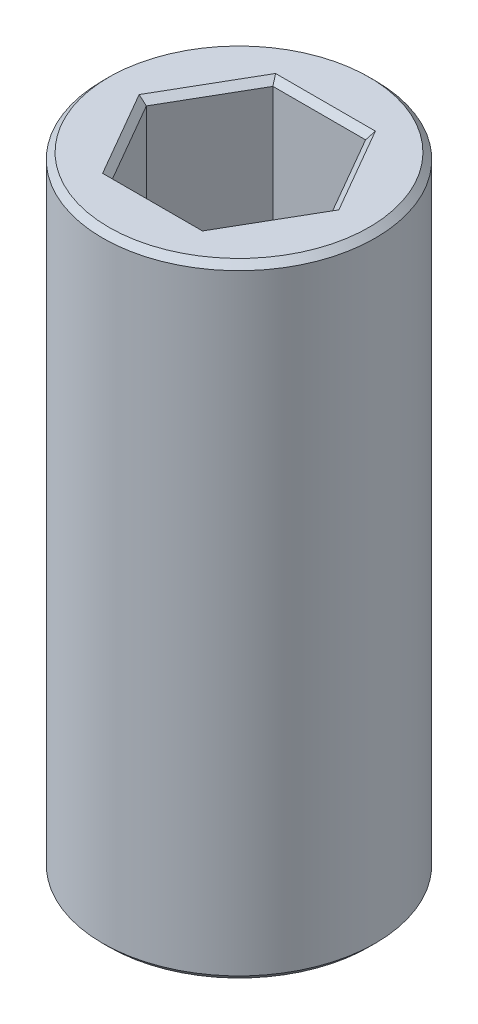
ISO-10303-21;
HEADER;
FILE_DESCRIPTION(('STEP AP214'),'2;1');
FILE_NAME('part.step','',(''),(''),'','','');
FILE_SCHEMA(('AUTOMOTIVE_DESIGN { 1 0 10303 214 1 1 1 1 }'));
ENDSEC;
DATA;
#1=APPLICATION_CONTEXT('core data for automotive mechanical design processes');
#2=APPLICATION_PROTOCOL_DEFINITION('international standard','automotive_design',2000,#1);
#3=PRODUCT_CONTEXT('',#1,'mechanical');
#4=PRODUCT('Part','Part','',(#3));
#5=PRODUCT_RELATED_PRODUCT_CATEGORY('part','',(#4));
#6=PRODUCT_DEFINITION_FORMATION('','',#4);
#7=PRODUCT_DEFINITION_CONTEXT('part definition',#1,'design');
#8=PRODUCT_DEFINITION('design','',#6,#7);
#9=PRODUCT_DEFINITION_SHAPE('','',#8);
#10=(LENGTH_UNIT() NAMED_UNIT(*) SI_UNIT(.MILLI.,.METRE.));
#11=(NAMED_UNIT(*) PLANE_ANGLE_UNIT() SI_UNIT($,.RADIAN.));
#12=(NAMED_UNIT(*) SI_UNIT($,.STERADIAN.) SOLID_ANGLE_UNIT());
#13=UNCERTAINTY_MEASURE_WITH_UNIT(LENGTH_MEASURE(1.E-05),#10,'distance_accuracy_value','');
#14=(GEOMETRIC_REPRESENTATION_CONTEXT(3) GLOBAL_UNCERTAINTY_ASSIGNED_CONTEXT((#13)) GLOBAL_UNIT_ASSIGNED_CONTEXT((#10,
#11,#12)) REPRESENTATION_CONTEXT('',''));
#15=CARTESIAN_POINT('',(0.,0.,0.));
#16=DIRECTION('',(0.,0.,1.));
#17=DIRECTION('',(1.,0.,0.));
#18=AXIS2_PLACEMENT_3D('',#15,#16,#17);
#19=CARTESIAN_POINT('',(0.,50.8,0.));
#20=DIRECTION('',(0.,1.,0.));
#21=DIRECTION('',(0.,0.,1.));
#22=AXIS2_PLACEMENT_3D('',#19,#20,#21);
#23=PLANE('',#22);
#24=CARTESIAN_POINT('',(0.,50.8,0.));
#25=DIRECTION('',(0.,1.,0.));
#26=DIRECTION('',(0.,0.,1.));
#27=AXIS2_PLACEMENT_3D('',#24,#25,#26);
#28=CIRCLE('',#27,10.6045);
#29=CARTESIAN_POINT('',(0.,50.8,10.6045));
#30=VERTEX_POINT('',#29);
#31=EDGE_CURVE('E11',#30,#30,#28,.T.);
#32=ORIENTED_EDGE('',*,*,#31,.T.);
#33=EDGE_LOOP('',(#32));
#34=FACE_BOUND('',#33,.T.);
#35=DIRECTION('',(-0.500000000000001,0.,-0.866025403784438));
#36=VECTOR('',#35,1.);
#37=CARTESIAN_POINT('',(-6.10418005857461,50.8,3.52425));
#38=LINE('',#37,#36);
#39=CARTESIAN_POINT('',(-4.06945337238307,50.8,7.0485));
#40=VERTEX_POINT('',#39);
#41=CARTESIAN_POINT('',(-8.13890674476615,50.8,0.));
#42=VERTEX_POINT('',#41);
#43=EDGE_CURVE('E62',#40,#42,#38,.T.);
#44=ORIENTED_EDGE('',*,*,#43,.T.);
#45=DIRECTION('',(0.5,0.,-0.866025403784439));
#46=VECTOR('',#45,1.);
#47=CARTESIAN_POINT('',(-6.10418005857462,50.8,-3.52425));
#48=LINE('',#47,#46);
#49=CARTESIAN_POINT('',(-4.06945337238308,50.8,-7.0485));
#50=VERTEX_POINT('',#49);
#51=EDGE_CURVE('E54',#42,#50,#48,.T.);
#52=ORIENTED_EDGE('',*,*,#51,.T.);
#53=DIRECTION('',(1.,0.,0.));
#54=VECTOR('',#53,1.);
#55=CARTESIAN_POINT('',(0.,50.8,-7.0485));
#56=LINE('',#55,#54);
#57=CARTESIAN_POINT('',(4.06945337238308,50.8,-7.0485));
#58=VERTEX_POINT('',#57);
#59=EDGE_CURVE('E230',#50,#58,#56,.T.);
#60=ORIENTED_EDGE('',*,*,#59,.T.);
#61=DIRECTION('',(0.5,0.,0.866025403784439));
#62=VECTOR('',#61,1.);
#63=CARTESIAN_POINT('',(6.10418005857462,50.8,-3.52425));
#64=LINE('',#63,#62);
#65=CARTESIAN_POINT('',(8.13890674476615,50.8,0.));
#66=VERTEX_POINT('',#65);
#67=EDGE_CURVE('E233',#58,#66,#64,.T.);
#68=ORIENTED_EDGE('',*,*,#67,.T.);
#69=DIRECTION('',(-0.499999999999999,0.,0.866025403784439));
#70=VECTOR('',#69,1.);
#71=CARTESIAN_POINT('',(6.10418005857462,50.8,3.52425));
#72=LINE('',#71,#70);
#73=CARTESIAN_POINT('',(4.06945337238308,50.8,7.0485));
#74=VERTEX_POINT('',#73);
#75=EDGE_CURVE('E236',#66,#74,#72,.T.);
#76=ORIENTED_EDGE('',*,*,#75,.T.);
#77=DIRECTION('',(-1.,0.,0.));
#78=VECTOR('',#77,1.);
#79=CARTESIAN_POINT('',(0.,50.8,7.0485));
#80=LINE('',#79,#78);
#81=EDGE_CURVE('E67',#74,#40,#80,.T.);
#82=ORIENTED_EDGE('',*,*,#81,.T.);
#83=EDGE_LOOP('',(#44,#52,#60,#68,#76,#82));
#84=FACE_BOUND('',#83,.T.);
#85=ADVANCED_FACE('F43',(#34,#84),#23,.T.);
#86=CARTESIAN_POINT('',(0.,0.,0.));
#87=DIRECTION('',(0.,1.,0.));
#88=DIRECTION('',(0.,0.,1.));
#89=AXIS2_PLACEMENT_3D('',#86,#87,#88);
#90=PLANE('',#89);
#91=DIRECTION('',(0.499999999999999,0.,-0.866025403784439));
#92=VECTOR('',#91,1.);
#93=CARTESIAN_POINT('',(7.99225977639198,0.,0.253999999999993));
#94=LINE('',#93,#92);
#95=CARTESIAN_POINT('',(4.06945337238308,0.,7.0485));
#96=VERTEX_POINT('',#95);
#97=CARTESIAN_POINT('',(8.13890674476615,0.,0.));
#98=VERTEX_POINT('',#97);
#99=EDGE_CURVE('E141',#96,#98,#94,.T.);
#100=ORIENTED_EDGE('',*,*,#99,.T.);
#101=DIRECTION('',(-0.5,0.,-0.866025403784439));
#102=VECTOR('',#101,1.);
#103=CARTESIAN_POINT('',(4.21610034075724,0.,-6.7945));
#104=LINE('',#103,#102);
#105=CARTESIAN_POINT('',(4.06945337238307,0.,-7.0485));
#106=VERTEX_POINT('',#105);
#107=EDGE_CURVE('E182',#98,#106,#104,.T.);
#108=ORIENTED_EDGE('',*,*,#107,.T.);
#109=DIRECTION('',(-1.,0.,0.));
#110=VECTOR('',#109,1.);
#111=CARTESIAN_POINT('',(-3.77615943563475,0.,-7.0485));
#112=LINE('',#111,#110);
#113=CARTESIAN_POINT('',(-4.06945337238307,0.,-7.0485));
#114=VERTEX_POINT('',#113);
#115=EDGE_CURVE('E179',#106,#114,#112,.T.);
#116=ORIENTED_EDGE('',*,*,#115,.T.);
#117=DIRECTION('',(-0.5,0.,0.866025403784439));
#118=VECTOR('',#117,1.);
#119=CARTESIAN_POINT('',(-7.99225977639198,0.,-0.253999999999991));
#120=LINE('',#119,#118);
#121=CARTESIAN_POINT('',(-8.13890674476615,0.,0.));
#122=VERTEX_POINT('',#121);
#123=EDGE_CURVE('E176',#114,#122,#120,.T.);
#124=ORIENTED_EDGE('',*,*,#123,.T.);
#125=DIRECTION('',(0.500000000000001,0.,0.866025403784438));
#126=VECTOR('',#125,1.);
#127=CARTESIAN_POINT('',(-4.21610034075723,0.,6.7945));
#128=LINE('',#127,#126);
#129=CARTESIAN_POINT('',(-4.06945337238307,0.,7.0485));
#130=VERTEX_POINT('',#129);
#131=EDGE_CURVE('E144',#122,#130,#128,.T.);
#132=ORIENTED_EDGE('',*,*,#131,.T.);
#133=DIRECTION('',(1.,0.,0.));
#134=VECTOR('',#133,1.);
#135=CARTESIAN_POINT('',(3.77615943563475,0.,7.0485));
#136=LINE('',#135,#134);
#137=EDGE_CURVE('E135',#130,#96,#136,.T.);
#138=ORIENTED_EDGE('',*,*,#137,.T.);
#139=EDGE_LOOP('',(#100,#108,#116,#124,#132,#138));
#140=FACE_BOUND('',#139,.T.);
#141=CARTESIAN_POINT('',(0.,0.,0.));
#142=DIRECTION('',(0.,1.,0.));
#143=DIRECTION('',(0.,0.,1.));
#144=AXIS2_PLACEMENT_3D('',#141,#142,#143);
#145=CIRCLE('',#144,10.6045);
#146=CARTESIAN_POINT('',(0.,0.,10.6045));
#147=VERTEX_POINT('',#146);
#148=EDGE_CURVE('E165',#147,#147,#145,.F.);
#149=ORIENTED_EDGE('',*,*,#148,.T.);
#150=EDGE_LOOP('',(#149));
#151=FACE_BOUND('',#150,.T.);
#152=ADVANCED_FACE('F137',(#140,#151),#90,.F.);
#153=CARTESIAN_POINT('',(0.,50.8,0.));
#154=DIRECTION('',(0.,-1.,0.));
#155=DIRECTION('',(0.,0.,-1.));
#156=AXIS2_PLACEMENT_3D('',#153,#154,#155);
#157=CYLINDRICAL_SURFACE('',#156,11.1125);
#158=CARTESIAN_POINT('',(0.,0.507999999999988,0.));
#159=DIRECTION('',(0.,1.,0.));
#160=DIRECTION('',(0.,0.,1.));
#161=AXIS2_PLACEMENT_3D('',#158,#159,#160);
#162=CIRCLE('',#161,11.1125);
#163=CARTESIAN_POINT('',(0.,0.507999999999988,11.1125));
#164=VERTEX_POINT('',#163);
#165=EDGE_CURVE('E226',#164,#164,#162,.T.);
#166=ORIENTED_EDGE('',*,*,#165,.T.);
#167=EDGE_LOOP('',(#166));
#168=FACE_BOUND('',#167,.T.);
#169=CARTESIAN_POINT('',(0.,50.292,0.));
#170=DIRECTION('',(0.,1.,0.));
#171=DIRECTION('',(0.,0.,1.));
#172=AXIS2_PLACEMENT_3D('',#169,#170,#171);
#173=CIRCLE('',#172,11.1125);
#174=CARTESIAN_POINT('',(0.,50.292,11.1125));
#175=VERTEX_POINT('',#174);
#176=EDGE_CURVE('E222',#175,#175,#173,.F.);
#177=ORIENTED_EDGE('',*,*,#176,.T.);
#178=EDGE_LOOP('',(#177));
#179=FACE_BOUND('',#178,.T.);
#180=ADVANCED_FACE('F379',(#168,#179),#157,.T.);
#181=CARTESIAN_POINT('',(3.77615943563475,50.8,6.5405));
#182=DIRECTION('',(-0.866025403784439,0.,-0.5));
#183=DIRECTION('',(-0.499999999999999,0.,0.866025403784439));
#184=AXIS2_PLACEMENT_3D('',#181,#182,#183);
#185=PLANE('',#184);
#186=DIRECTION('',(0.,-1.,0.));
#187=VECTOR('',#186,1.);
#188=CARTESIAN_POINT('',(7.55231887126949,50.8,0.));
#189=LINE('',#188,#187);
#190=CARTESIAN_POINT('',(7.55231887126949,50.292,0.));
#191=VERTEX_POINT('',#190);
#192=CARTESIAN_POINT('',(7.55231887126949,0.507999999999995,0.));
#193=VERTEX_POINT('',#192);
#194=EDGE_CURVE('E170',#191,#193,#189,.T.);
#195=ORIENTED_EDGE('',*,*,#194,.T.);
#196=DIRECTION('',(-0.499999999999999,0.,0.866025403784439));
#197=VECTOR('',#196,1.);
#198=CARTESIAN_POINT('',(3.77615943563475,0.507999999999995,6.5405));
#199=LINE('',#198,#197);
#200=CARTESIAN_POINT('',(3.77615943563475,0.507999999999995,6.5405));
#201=VERTEX_POINT('',#200);
#202=EDGE_CURVE('E219',#193,#201,#199,.T.);
#203=ORIENTED_EDGE('',*,*,#202,.T.);
#204=DIRECTION('',(0.,-1.,0.));
#205=VECTOR('',#204,1.);
#206=CARTESIAN_POINT('',(3.77615943563475,50.8,6.5405));
#207=LINE('',#206,#205);
#208=CARTESIAN_POINT('',(3.77615943563475,50.292,6.5405));
#209=VERTEX_POINT('',#208);
#210=EDGE_CURVE('E259',#209,#201,#207,.T.);
#211=ORIENTED_EDGE('',*,*,#210,.F.);
#212=DIRECTION('',(0.499999999999999,0.,-0.866025403784439));
#213=VECTOR('',#212,1.);
#214=CARTESIAN_POINT('',(3.77615943563475,50.292,6.5405));
#215=LINE('',#214,#213);
#216=EDGE_CURVE('E216',#209,#191,#215,.T.);
#217=ORIENTED_EDGE('',*,*,#216,.T.);
#218=EDGE_LOOP('',(#195,#203,#211,#217));
#219=FACE_BOUND('',#218,.T.);
#220=ADVANCED_FACE('F327',(#219),#185,.T.);
#221=CARTESIAN_POINT('',(7.55231887126949,50.8,0.));
#222=DIRECTION('',(-0.866025403784438,0.,0.5));
#223=DIRECTION('',(0.5,0.,0.866025403784439));
#224=AXIS2_PLACEMENT_3D('',#221,#222,#223);
#225=PLANE('',#224);
#226=DIRECTION('',(0.,-1.,0.));
#227=VECTOR('',#226,1.);
#228=CARTESIAN_POINT('',(3.77615943563475,50.8,-6.5405));
#229=LINE('',#228,#227);
#230=CARTESIAN_POINT('',(3.77615943563475,50.292,-6.5405));
#231=VERTEX_POINT('',#230);
#232=CARTESIAN_POINT('',(3.77615943563475,0.507999999999995,-6.5405));
#233=VERTEX_POINT('',#232);
#234=EDGE_CURVE('E306',#231,#233,#229,.T.);
#235=ORIENTED_EDGE('',*,*,#234,.T.);
#236=DIRECTION('',(0.5,0.,0.866025403784439));
#237=VECTOR('',#236,1.);
#238=CARTESIAN_POINT('',(7.55231887126949,0.507999999999994,0.));
#239=LINE('',#238,#237);
#240=EDGE_CURVE('E188',#233,#193,#239,.T.);
#241=ORIENTED_EDGE('',*,*,#240,.T.);
#242=ORIENTED_EDGE('',*,*,#194,.F.);
#243=DIRECTION('',(-0.5,0.,-0.866025403784439));
#244=VECTOR('',#243,1.);
#245=CARTESIAN_POINT('',(7.55231887126949,50.292,0.));
#246=LINE('',#245,#244);
#247=EDGE_CURVE('E185',#191,#231,#246,.T.);
#248=ORIENTED_EDGE('',*,*,#247,.T.);
#249=EDGE_LOOP('',(#235,#241,#242,#248));
#250=FACE_BOUND('',#249,.T.);
#251=ADVANCED_FACE('F331',(#250),#225,.T.);
#252=CARTESIAN_POINT('',(3.77615943563475,50.8,-6.5405));
#253=DIRECTION('',(0.,0.,1.));
#254=DIRECTION('',(1.,0.,0.));
#255=AXIS2_PLACEMENT_3D('',#252,#253,#254);
#256=PLANE('',#255);
#257=DIRECTION('',(0.,-1.,0.));
#258=VECTOR('',#257,1.);
#259=CARTESIAN_POINT('',(-3.77615943563475,50.8,-6.5405));
#260=LINE('',#259,#258);
#261=CARTESIAN_POINT('',(-3.77615943563475,50.292,-6.5405));
#262=VERTEX_POINT('',#261);
#263=CARTESIAN_POINT('',(-3.77615943563475,0.507999999999995,-6.5405));
#264=VERTEX_POINT('',#263);
#265=EDGE_CURVE('E303',#262,#264,#260,.T.);
#266=ORIENTED_EDGE('',*,*,#265,.T.);
#267=DIRECTION('',(1.,0.,0.));
#268=VECTOR('',#267,1.);
#269=CARTESIAN_POINT('',(3.77615943563475,0.507999999999995,-6.5405));
#270=LINE('',#269,#268);
#271=EDGE_CURVE('E195',#264,#233,#270,.T.);
#272=ORIENTED_EDGE('',*,*,#271,.T.);
#273=ORIENTED_EDGE('',*,*,#234,.F.);
#274=DIRECTION('',(-1.,0.,0.));
#275=VECTOR('',#274,1.);
#276=CARTESIAN_POINT('',(3.77615943563475,50.292,-6.5405));
#277=LINE('',#276,#275);
#278=EDGE_CURVE('E192',#231,#262,#277,.T.);
#279=ORIENTED_EDGE('',*,*,#278,.T.);
#280=EDGE_LOOP('',(#266,#272,#273,#279));
#281=FACE_BOUND('',#280,.T.);
#282=ADVANCED_FACE('F302',(#281),#256,.T.);
#283=CARTESIAN_POINT('',(-3.77615943563475,50.8,-6.5405));
#284=DIRECTION('',(0.866025403784439,0.,0.5));
#285=DIRECTION('',(0.5,0.,-0.866025403784439));
#286=AXIS2_PLACEMENT_3D('',#283,#284,#285);
#287=PLANE('',#286);
#288=DIRECTION('',(0.,-1.,0.));
#289=VECTOR('',#288,1.);
#290=CARTESIAN_POINT('',(-7.55231887126949,50.8,0.));
#291=LINE('',#290,#289);
#292=CARTESIAN_POINT('',(-7.55231887126949,50.292,0.));
#293=VERTEX_POINT('',#292);
#294=CARTESIAN_POINT('',(-7.55231887126949,0.507999999999995,0.));
#295=VERTEX_POINT('',#294);
#296=EDGE_CURVE('E313',#293,#295,#291,.T.);
#297=ORIENTED_EDGE('',*,*,#296,.T.);
#298=DIRECTION('',(0.5,0.,-0.866025403784439));
#299=VECTOR('',#298,1.);
#300=CARTESIAN_POINT('',(-3.77615943563475,0.507999999999995,-6.5405));
#301=LINE('',#300,#299);
#302=EDGE_CURVE('E202',#295,#264,#301,.T.);
#303=ORIENTED_EDGE('',*,*,#302,.T.);
#304=ORIENTED_EDGE('',*,*,#265,.F.);
#305=DIRECTION('',(-0.5,0.,0.866025403784439));
#306=VECTOR('',#305,1.);
#307=CARTESIAN_POINT('',(-3.77615943563475,50.292,-6.5405));
#308=LINE('',#307,#306);
#309=EDGE_CURVE('E198',#262,#293,#308,.T.);
#310=ORIENTED_EDGE('',*,*,#309,.T.);
#311=EDGE_LOOP('',(#297,#303,#304,#310));
#312=FACE_BOUND('',#311,.T.);
#313=ADVANCED_FACE('F309',(#312),#287,.T.);
#314=CARTESIAN_POINT('',(-7.55231887126949,50.8,0.));
#315=DIRECTION('',(0.866025403784438,0.,-0.5));
#316=DIRECTION('',(-0.500000000000001,0.,-0.866025403784438));
#317=AXIS2_PLACEMENT_3D('',#314,#315,#316);
#318=PLANE('',#317);
#319=DIRECTION('',(0.,-1.,0.));
#320=VECTOR('',#319,1.);
#321=CARTESIAN_POINT('',(-3.77615943563474,50.8,6.5405));
#322=LINE('',#321,#320);
#323=CARTESIAN_POINT('',(-3.77615943563474,50.292,6.5405));
#324=VERTEX_POINT('',#323);
#325=CARTESIAN_POINT('',(-3.77615943563474,0.507999999999995,6.5405));
#326=VERTEX_POINT('',#325);
#327=EDGE_CURVE('E319',#324,#326,#322,.T.);
#328=ORIENTED_EDGE('',*,*,#327,.T.);
#329=DIRECTION('',(-0.500000000000001,0.,-0.866025403784438));
#330=VECTOR('',#329,1.);
#331=CARTESIAN_POINT('',(-7.55231887126949,0.507999999999995,0.));
#332=LINE('',#331,#330);
#333=EDGE_CURVE('E208',#326,#295,#332,.T.);
#334=ORIENTED_EDGE('',*,*,#333,.T.);
#335=ORIENTED_EDGE('',*,*,#296,.F.);
#336=DIRECTION('',(0.500000000000001,0.,0.866025403784438));
#337=VECTOR('',#336,1.);
#338=CARTESIAN_POINT('',(-7.55231887126949,50.292,0.));
#339=LINE('',#338,#337);
#340=EDGE_CURVE('E205',#293,#324,#339,.T.);
#341=ORIENTED_EDGE('',*,*,#340,.T.);
#342=EDGE_LOOP('',(#328,#334,#335,#341));
#343=FACE_BOUND('',#342,.T.);
#344=ADVANCED_FACE('F349',(#343),#318,.T.);
#345=CARTESIAN_POINT('',(-3.77615943563474,50.8,6.5405));
#346=DIRECTION('',(0.,0.,-1.));
#347=DIRECTION('',(-1.,0.,0.));
#348=AXIS2_PLACEMENT_3D('',#345,#346,#347);
#349=PLANE('',#348);
#350=ORIENTED_EDGE('',*,*,#210,.T.);
#351=DIRECTION('',(-1.,0.,0.));
#352=VECTOR('',#351,1.);
#353=CARTESIAN_POINT('',(-3.77615943563474,0.507999999999995,6.5405));
#354=LINE('',#353,#352);
#355=EDGE_CURVE('E154',#201,#326,#354,.T.);
#356=ORIENTED_EDGE('',*,*,#355,.T.);
#357=ORIENTED_EDGE('',*,*,#327,.F.);
#358=DIRECTION('',(1.,0.,0.));
#359=VECTOR('',#358,1.);
#360=CARTESIAN_POINT('',(-3.77615943563474,50.292,6.5405));
#361=LINE('',#360,#359);
#362=EDGE_CURVE('E211',#324,#209,#361,.T.);
#363=ORIENTED_EDGE('',*,*,#362,.T.);
#364=EDGE_LOOP('',(#350,#356,#357,#363));
#365=FACE_BOUND('',#364,.T.);
#366=ADVANCED_FACE('F358',(#365),#349,.T.);
#367=CARTESIAN_POINT('',(-6.10418005857461,0.,3.52425));
#368=DIRECTION('',(0.612372435695793,-0.707106781186548,-0.353553390593274));
#369=DIRECTION('',(-0.500000000000001,0.,-0.866025403784438));
#370=AXIS2_PLACEMENT_3D('',#367,#368,#369);
#371=PLANE('',#370);
#372=DIRECTION('',(0.755928946018455,0.654653670707977,0.));
#373=VECTOR('',#372,1.);
#374=CARTESIAN_POINT('',(-6.97620578122812,1.00692857142857,0.));
#375=LINE('',#374,#373);
#376=EDGE_CURVE('E158',#295,#122,#375,.F.);
#377=ORIENTED_EDGE('',*,*,#376,.F.);
#378=ORIENTED_EDGE('',*,*,#333,.F.);
#379=DIRECTION('',(0.377964473009229,0.654653670707977,-0.654653670707977));
#380=VECTOR('',#379,1.);
#381=CARTESIAN_POINT('',(-3.48810289061406,1.00692857142857,6.04157142857143));
#382=LINE('',#381,#380);
#383=EDGE_CURVE('E256',#130,#326,#382,.T.);
#384=ORIENTED_EDGE('',*,*,#383,.F.);
#385=ORIENTED_EDGE('',*,*,#131,.F.);
#386=EDGE_LOOP('',(#377,#378,#384,#385));
#387=FACE_BOUND('',#386,.T.);
#388=ADVANCED_FACE('F346',(#387),#371,.T.);
#389=CARTESIAN_POINT('',(0.,0.,7.0485));
#390=DIRECTION('',(0.,-0.707106781186548,-0.707106781186548));
#391=DIRECTION('',(-1.,0.,0.));
#392=AXIS2_PLACEMENT_3D('',#389,#390,#391);
#393=PLANE('',#392);
#394=ORIENTED_EDGE('',*,*,#383,.T.);
#395=ORIENTED_EDGE('',*,*,#355,.F.);
#396=DIRECTION('',(-0.377964473009229,0.654653670707977,-0.654653670707976));
#397=VECTOR('',#396,1.);
#398=CARTESIAN_POINT('',(3.48810289061406,1.00692857142858,6.04157142857142));
#399=LINE('',#398,#397);
#400=EDGE_CURVE('E152',#96,#201,#399,.T.);
#401=ORIENTED_EDGE('',*,*,#400,.F.);
#402=ORIENTED_EDGE('',*,*,#137,.F.);
#403=EDGE_LOOP('',(#394,#395,#401,#402));
#404=FACE_BOUND('',#403,.T.);
#405=ADVANCED_FACE('F153',(#404),#393,.T.);
#406=CARTESIAN_POINT('',(-6.10418005857461,0.,-3.52424999999999));
#407=DIRECTION('',(0.612372435695795,-0.707106781186548,0.353553390593273));
#408=DIRECTION('',(0.5,0.,-0.866025403784439));
#409=AXIS2_PLACEMENT_3D('',#406,#407,#408);
#410=PLANE('',#409);
#411=ORIENTED_EDGE('',*,*,#376,.T.);
#412=ORIENTED_EDGE('',*,*,#123,.F.);
#413=DIRECTION('',(0.377964473009228,0.654653670707977,0.654653670707977));
#414=VECTOR('',#413,1.);
#415=CARTESIAN_POINT('',(-3.48810289061406,1.00692857142857,-6.04157142857142));
#416=LINE('',#415,#414);
#417=EDGE_CURVE('E159',#264,#114,#416,.F.);
#418=ORIENTED_EDGE('',*,*,#417,.F.);
#419=ORIENTED_EDGE('',*,*,#302,.F.);
#420=EDGE_LOOP('',(#411,#412,#418,#419));
#421=FACE_BOUND('',#420,.T.);
#422=ADVANCED_FACE('F342',(#421),#410,.T.);
#423=CARTESIAN_POINT('',(6.10418005857461,0.,3.52424999999999));
#424=DIRECTION('',(-0.612372435695794,-0.707106781186548,-0.353553390593273));
#425=DIRECTION('',(-0.499999999999999,0.,0.866025403784439));
#426=AXIS2_PLACEMENT_3D('',#423,#424,#425);
#427=PLANE('',#426);
#428=ORIENTED_EDGE('',*,*,#400,.T.);
#429=ORIENTED_EDGE('',*,*,#202,.F.);
#430=DIRECTION('',(0.755928946018456,-0.654653670707976,0.));
#431=VECTOR('',#430,1.);
#432=CARTESIAN_POINT('',(6.97620578122813,1.00692857142857,0.));
#433=LINE('',#432,#431);
#434=EDGE_CURVE('E162',#98,#193,#433,.F.);
#435=ORIENTED_EDGE('',*,*,#434,.F.);
#436=ORIENTED_EDGE('',*,*,#99,.F.);
#437=EDGE_LOOP('',(#428,#429,#435,#436));
#438=FACE_BOUND('',#437,.T.);
#439=ADVANCED_FACE('F161',(#438),#427,.T.);
#440=CARTESIAN_POINT('',(0.,0.,-7.0485));
#441=DIRECTION('',(0.,-0.707106781186548,0.707106781186548));
#442=DIRECTION('',(1.,0.,0.));
#443=AXIS2_PLACEMENT_3D('',#440,#441,#442);
#444=PLANE('',#443);
#445=ORIENTED_EDGE('',*,*,#417,.T.);
#446=ORIENTED_EDGE('',*,*,#115,.F.);
#447=DIRECTION('',(-0.37796447300923,0.654653670707976,0.654653670707976));
#448=VECTOR('',#447,1.);
#449=CARTESIAN_POINT('',(3.48810289061406,1.00692857142856,-6.04157142857143));
#450=LINE('',#449,#448);
#451=EDGE_CURVE('E245',#233,#106,#450,.F.);
#452=ORIENTED_EDGE('',*,*,#451,.F.);
#453=ORIENTED_EDGE('',*,*,#271,.F.);
#454=EDGE_LOOP('',(#445,#446,#452,#453));
#455=FACE_BOUND('',#454,.T.);
#456=ADVANCED_FACE('F339',(#455),#444,.T.);
#457=CARTESIAN_POINT('',(6.10418005857461,0.,-3.52425));
#458=DIRECTION('',(-0.612372435695793,-0.707106781186549,0.353553390593273));
#459=DIRECTION('',(0.5,0.,0.866025403784439));
#460=AXIS2_PLACEMENT_3D('',#457,#458,#459);
#461=PLANE('',#460);
#462=ORIENTED_EDGE('',*,*,#434,.T.);
#463=ORIENTED_EDGE('',*,*,#240,.F.);
#464=ORIENTED_EDGE('',*,*,#451,.T.);
#465=ORIENTED_EDGE('',*,*,#107,.F.);
#466=EDGE_LOOP('',(#462,#463,#464,#465));
#467=FACE_BOUND('',#466,.T.);
#468=ADVANCED_FACE('F335',(#467),#461,.T.);
#469=CARTESIAN_POINT('',(0.,0.507999999999988,0.));
#470=DIRECTION('',(0.,1.,0.));
#471=DIRECTION('',(0.,0.,1.));
#472=AXIS2_PLACEMENT_3D('',#469,#470,#471);
#473=CONICAL_SURFACE('',#472,11.1125,0.78539816339745);
#474=ORIENTED_EDGE('',*,*,#148,.F.);
#475=EDGE_LOOP('',(#474));
#476=FACE_BOUND('',#475,.T.);
#477=ORIENTED_EDGE('',*,*,#165,.F.);
#478=EDGE_LOOP('',(#477));
#479=FACE_BOUND('',#478,.T.);
#480=ADVANCED_FACE('F394',(#476,#479),#473,.T.);
#481=CARTESIAN_POINT('',(0.,50.8,0.));
#482=DIRECTION('',(0.,-1.,0.));
#483=DIRECTION('',(0.,0.,-1.));
#484=AXIS2_PLACEMENT_3D('',#481,#482,#483);
#485=CONICAL_SURFACE('',#484,10.6045,0.785398163397445);
#486=ORIENTED_EDGE('',*,*,#176,.F.);
#487=EDGE_LOOP('',(#486));
#488=FACE_BOUND('',#487,.T.);
#489=ORIENTED_EDGE('',*,*,#31,.F.);
#490=EDGE_LOOP('',(#489));
#491=FACE_BOUND('',#490,.T.);
#492=ADVANCED_FACE('F423',(#488,#491),#485,.T.);
#493=CARTESIAN_POINT('',(3.77615943563475,50.292,6.5405));
#494=DIRECTION('',(0.612372435695794,-0.707106781186548,0.353553390593273));
#495=DIRECTION('',(0.499999999999999,0.,-0.866025403784439));
#496=AXIS2_PLACEMENT_3D('',#493,#494,#495);
#497=PLANE('',#496);
#498=DIRECTION('',(0.377964473009229,0.654653670707977,0.654653670707977));
#499=VECTOR('',#498,1.);
#500=CARTESIAN_POINT('',(2.6972567397391,48.4232857142857,4.67178571428571));
#501=LINE('',#500,#499);
#502=EDGE_CURVE('E273',#74,#209,#501,.F.);
#503=ORIENTED_EDGE('',*,*,#502,.F.);
#504=ORIENTED_EDGE('',*,*,#75,.F.);
#505=DIRECTION('',(0.755928946018455,0.654653670707977,0.));
#506=VECTOR('',#505,1.);
#507=CARTESIAN_POINT('',(5.39451347947822,48.4232857142857,0.));
#508=LINE('',#507,#506);
#509=EDGE_CURVE('E48',#191,#66,#508,.T.);
#510=ORIENTED_EDGE('',*,*,#509,.F.);
#511=ORIENTED_EDGE('',*,*,#216,.F.);
#512=EDGE_LOOP('',(#503,#504,#510,#511));
#513=FACE_BOUND('',#512,.T.);
#514=ADVANCED_FACE('F46',(#513),#497,.F.);
#515=CARTESIAN_POINT('',(7.55231887126949,50.292,0.));
#516=DIRECTION('',(0.612372435695795,-0.707106781186547,-0.353553390593274));
#517=DIRECTION('',(-0.5,0.,-0.866025403784439));
#518=AXIS2_PLACEMENT_3D('',#515,#516,#517);
#519=PLANE('',#518);
#520=ORIENTED_EDGE('',*,*,#509,.T.);
#521=ORIENTED_EDGE('',*,*,#67,.F.);
#522=DIRECTION('',(0.377964473009227,0.654653670707977,-0.654653670707977));
#523=VECTOR('',#522,1.);
#524=CARTESIAN_POINT('',(2.69725673973911,48.4232857142857,-4.67178571428571));
#525=LINE('',#524,#523);
#526=EDGE_CURVE('E270',#231,#58,#525,.T.);
#527=ORIENTED_EDGE('',*,*,#526,.F.);
#528=ORIENTED_EDGE('',*,*,#247,.F.);
#529=EDGE_LOOP('',(#520,#521,#527,#528));
#530=FACE_BOUND('',#529,.T.);
#531=ADVANCED_FACE('F287',(#530),#519,.F.);
#532=CARTESIAN_POINT('',(-3.77615943563474,50.292,6.5405));
#533=DIRECTION('',(0.,-0.707106781186547,0.707106781186547));
#534=DIRECTION('',(1.,0.,0.));
#535=AXIS2_PLACEMENT_3D('',#532,#533,#534);
#536=PLANE('',#535);
#537=ORIENTED_EDGE('',*,*,#502,.T.);
#538=ORIENTED_EDGE('',*,*,#362,.F.);
#539=DIRECTION('',(-0.377964473009226,0.654653670707977,0.654653670707977));
#540=VECTOR('',#539,1.);
#541=CARTESIAN_POINT('',(-2.6972567397391,48.4232857142857,4.67178571428571));
#542=LINE('',#541,#540);
#543=EDGE_CURVE('E266',#40,#324,#542,.F.);
#544=ORIENTED_EDGE('',*,*,#543,.F.);
#545=ORIENTED_EDGE('',*,*,#81,.F.);
#546=EDGE_LOOP('',(#537,#538,#544,#545));
#547=FACE_BOUND('',#546,.T.);
#548=ADVANCED_FACE('F359',(#547),#536,.F.);
#549=CARTESIAN_POINT('',(3.77615943563475,50.292,-6.5405));
#550=DIRECTION('',(0.,-0.707106781186547,-0.707106781186547));
#551=DIRECTION('',(-1.,0.,0.));
#552=AXIS2_PLACEMENT_3D('',#549,#550,#551);
#553=PLANE('',#552);
#554=ORIENTED_EDGE('',*,*,#526,.T.);
#555=ORIENTED_EDGE('',*,*,#59,.F.);
#556=DIRECTION('',(0.377964473009228,-0.654653670707977,0.654653670707977));
#557=VECTOR('',#556,1.);
#558=CARTESIAN_POINT('',(-3.77615943563475,50.292,-6.5405));
#559=LINE('',#558,#557);
#560=EDGE_CURVE('E263',#262,#50,#559,.F.);
#561=ORIENTED_EDGE('',*,*,#560,.F.);
#562=ORIENTED_EDGE('',*,*,#278,.F.);
#563=EDGE_LOOP('',(#554,#555,#561,#562));
#564=FACE_BOUND('',#563,.T.);
#565=ADVANCED_FACE('F295',(#564),#553,.F.);
#566=CARTESIAN_POINT('',(-7.55231887126949,50.292,0.));
#567=DIRECTION('',(-0.612372435695795,-0.707106781186547,0.353553390593274));
#568=DIRECTION('',(0.500000000000001,0.,0.866025403784438));
#569=AXIS2_PLACEMENT_3D('',#566,#567,#568);
#570=PLANE('',#569);
#571=ORIENTED_EDGE('',*,*,#543,.T.);
#572=ORIENTED_EDGE('',*,*,#340,.F.);
#573=DIRECTION('',(-0.755928946018454,0.654653670707977,0.));
#574=VECTOR('',#573,1.);
#575=CARTESIAN_POINT('',(-5.39451347947821,48.4232857142857,0.));
#576=LINE('',#575,#574);
#577=EDGE_CURVE('E260',#42,#293,#576,.F.);
#578=ORIENTED_EDGE('',*,*,#577,.F.);
#579=ORIENTED_EDGE('',*,*,#43,.F.);
#580=EDGE_LOOP('',(#571,#572,#578,#579));
#581=FACE_BOUND('',#580,.T.);
#582=ADVANCED_FACE('F361',(#581),#570,.F.);
#583=CARTESIAN_POINT('',(-3.77615943563475,50.292,-6.5405));
#584=DIRECTION('',(-0.612372435695795,-0.707106781186548,-0.353553390593273));
#585=DIRECTION('',(-0.5,0.,0.866025403784439));
#586=AXIS2_PLACEMENT_3D('',#583,#584,#585);
#587=PLANE('',#586);
#588=ORIENTED_EDGE('',*,*,#560,.T.);
#589=ORIENTED_EDGE('',*,*,#51,.F.);
#590=ORIENTED_EDGE('',*,*,#577,.T.);
#591=ORIENTED_EDGE('',*,*,#309,.F.);
#592=EDGE_LOOP('',(#588,#589,#590,#591));
#593=FACE_BOUND('',#592,.T.);
#594=ADVANCED_FACE('F364',(#593),#587,.F.);
#595=CLOSED_SHELL('',(#85,#152,#180,#220,#251,#282,#313,#344,#366,#388,#405,#422,#439,#456,#468,
#480,#492,#514,#531,#548,#565,#582,#594));
#596=MANIFOLD_SOLID_BREP('B2',#595);
#597=ADVANCED_BREP_SHAPE_REPRESENTATION('',(#18,#596),#14);
#598=SHAPE_DEFINITION_REPRESENTATION(#9,#597);
ENDSEC;
END-ISO-10303-21;
